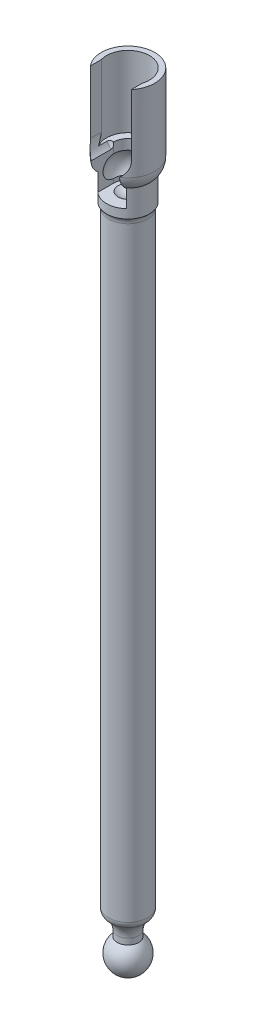
ISO-10303-21;
HEADER;
FILE_DESCRIPTION(('STEP AP214'),'2;1');
FILE_NAME('part.step','',(''),(''),'','','');
FILE_SCHEMA(('AUTOMOTIVE_DESIGN { 1 0 10303 214 1 1 1 1 }'));
ENDSEC;
DATA;
#1=APPLICATION_CONTEXT('core data for automotive mechanical design processes');
#2=APPLICATION_PROTOCOL_DEFINITION('international standard','automotive_design',2000,#1);
#3=PRODUCT_CONTEXT('',#1,'mechanical');
#4=PRODUCT('Part','Part','',(#3));
#5=PRODUCT_RELATED_PRODUCT_CATEGORY('part','',(#4));
#6=PRODUCT_DEFINITION_FORMATION('','',#4);
#7=PRODUCT_DEFINITION_CONTEXT('part definition',#1,'design');
#8=PRODUCT_DEFINITION('design','',#6,#7);
#9=PRODUCT_DEFINITION_SHAPE('','',#8);
#10=(LENGTH_UNIT() NAMED_UNIT(*) SI_UNIT(.MILLI.,.METRE.));
#11=(NAMED_UNIT(*) PLANE_ANGLE_UNIT() SI_UNIT($,.RADIAN.));
#12=(NAMED_UNIT(*) SI_UNIT($,.STERADIAN.) SOLID_ANGLE_UNIT());
#13=UNCERTAINTY_MEASURE_WITH_UNIT(LENGTH_MEASURE(1.E-05),#10,'distance_accuracy_value','');
#14=(GEOMETRIC_REPRESENTATION_CONTEXT(3) GLOBAL_UNCERTAINTY_ASSIGNED_CONTEXT((#13)) GLOBAL_UNIT_ASSIGNED_CONTEXT((#10,
#11,#12)) REPRESENTATION_CONTEXT('',''));
#15=CARTESIAN_POINT('',(0.,0.,0.));
#16=DIRECTION('',(0.,0.,1.));
#17=DIRECTION('',(1.,0.,0.));
#18=AXIS2_PLACEMENT_3D('',#15,#16,#17);
#19=CARTESIAN_POINT('',(0.,390.,0.));
#20=DIRECTION('',(0.,1.,0.));
#21=DIRECTION('',(0.,0.,1.));
#22=AXIS2_PLACEMENT_3D('',#19,#20,#21);
#23=PLANE('',#22);
#24=CARTESIAN_POINT('',(0.,390.,0.));
#25=DIRECTION('',(0.,1.,0.));
#26=DIRECTION('',(0.,0.,1.));
#27=AXIS2_PLACEMENT_3D('',#24,#25,#26);
#28=CIRCLE('',#27,12.);
#29=CARTESIAN_POINT('',(10.3048336165887,390.,6.14901651765742));
#30=VERTEX_POINT('',#29);
#31=CARTESIAN_POINT('',(-10.3048336165887,390.,6.14901651765739));
#32=VERTEX_POINT('',#31);
#33=EDGE_CURVE('E222',#30,#32,#28,.T.);
#34=ORIENTED_EDGE('',*,*,#33,.T.);
#35=DIRECTION('',(0.,0.,1.));
#36=VECTOR('',#35,1.);
#37=CARTESIAN_POINT('',(-10.3048336165887,390.,6.1490165176574));
#38=LINE('',#37,#36);
#39=CARTESIAN_POINT('',(-10.3048336165887,390.,1.5));
#40=VERTEX_POINT('',#39);
#41=EDGE_CURVE('E361',#32,#40,#38,.F.);
#42=ORIENTED_EDGE('',*,*,#41,.T.);
#43=CARTESIAN_POINT('',(-10.3048336165887,390.,1.5));
#44=CARTESIAN_POINT('',(-10.3048355156764,390.,1.46158188277618));
#45=CARTESIAN_POINT('',(-10.3031560827793,390.,1.42318343524848));
#46=CARTESIAN_POINT('',(-10.2964710002613,390.,1.34668709614987));
#47=CARTESIAN_POINT('',(-10.2914662196851,390.,1.3085891286832));
#48=CARTESIAN_POINT('',(-10.2715768600153,390.,1.1954469389797));
#49=CARTESIAN_POINT('',(-10.2518165014391,390.,1.12120517457586));
#50=CARTESIAN_POINT('',(-10.2001744096831,390.,0.977180085756621));
#51=CARTESIAN_POINT('',(-10.1682992005171,390.,0.907394385272954));
#52=CARTESIAN_POINT('',(-10.0937247632403,390.,0.773835282041916));
#53=CARTESIAN_POINT('',(-10.0510184680855,390.,0.710065842187068));
#54=CARTESIAN_POINT('',(-9.9543964620345,390.,0.587363486014589));
#55=CARTESIAN_POINT('',(-9.900090655276,390.,0.528739076773228));
#56=CARTESIAN_POINT('',(-9.78331311320155,390.,0.420348592512671));
#57=CARTESIAN_POINT('',(-9.72084084631768,390.,0.370583094632614));
#58=CARTESIAN_POINT('',(-9.58218638631705,390.,0.275361079867849));
#59=CARTESIAN_POINT('',(-9.50525218099368,390.,0.231001818262378));
#60=CARTESIAN_POINT('',(-9.34564760323151,390.,0.15397916263549));
#61=CARTESIAN_POINT('',(-9.26296827770835,390.,0.121334535555457));
#62=CARTESIAN_POINT('',(-9.07775316759587,390.,0.062575451710266));
#63=CARTESIAN_POINT('',(-8.97444491968277,390.,0.0389054671836883));
#64=CARTESIAN_POINT('',(-8.76573955696903,390.,0.00762805784349258));
#65=CARTESIAN_POINT('',(-8.66035018313294,390.,-3.05173401683437E-05));
#66=CARTESIAN_POINT('',(-8.55514670406013,390.,0.));
#67=B_SPLINE_CURVE_WITH_KNOTS('',3,(#43,#44,#45,#46,#47,#48,#49,#50,#51,#52,#53,#54,#55,#56,#57,
#58,#59,#60,#61,#62,#63,#64,#65,#66),.UNSPECIFIED.,.F.,.F.,(4,2,2,2,2,2,2,2,2,2,2,4),(0.,
0.115179201680137,0.230328314323595,0.459592903748564,0.688734205563041,0.918025403381416,
1.15678604986238,1.39556224540101,1.66093263366225,1.926726269344,2.24337458385086,
2.55900977182349),.UNSPECIFIED.);
#68=CARTESIAN_POINT('',(-8.55514670406013,390.,0.));
#69=VERTEX_POINT('',#68);
#70=EDGE_CURVE('E11',#40,#69,#67,.T.);
#71=ORIENTED_EDGE('',*,*,#70,.T.);
#72=DIRECTION('',(1.,0.,0.));
#73=VECTOR('',#72,1.);
#74=CARTESIAN_POINT('',(0.,390.,0.));
#75=LINE('',#74,#73);
#76=CARTESIAN_POINT('',(-8.,390.,0.));
#77=VERTEX_POINT('',#76);
#78=EDGE_CURVE('E191',#69,#77,#75,.T.);
#79=ORIENTED_EDGE('',*,*,#78,.T.);
#80=CARTESIAN_POINT('',(0.,390.,0.));
#81=DIRECTION('',(0.,-1.,0.));
#82=DIRECTION('',(0.,0.,1.));
#83=AXIS2_PLACEMENT_3D('',#80,#81,#82);
#84=CIRCLE('',#83,8.);
#85=CARTESIAN_POINT('',(8.,390.,0.));
#86=VERTEX_POINT('',#85);
#87=EDGE_CURVE('E218',#77,#86,#84,.T.);
#88=ORIENTED_EDGE('',*,*,#87,.T.);
#89=CARTESIAN_POINT('',(8.55514670406011,390.,0.));
#90=VERTEX_POINT('',#89);
#91=EDGE_CURVE('E430',#86,#90,#75,.T.);
#92=ORIENTED_EDGE('',*,*,#91,.T.);
#93=CARTESIAN_POINT('',(8.55514670406011,390.,0.));
#94=CARTESIAN_POINT('',(8.61894598459048,390.,1.14862435072787E-05));
#95=CARTESIAN_POINT('',(8.68270974756061,390.,0.00280767934706547));
#96=CARTESIAN_POINT('',(8.80980418022889,390.,0.0141538572855706));
#97=CARTESIAN_POINT('',(8.87313417339725,390.,0.0227113724203095));
#98=CARTESIAN_POINT('',(9.06197773156034,390.,0.0573476422173187));
#99=CARTESIAN_POINT('',(9.18603518002023,390.,0.0923918676810224));
#100=CARTESIAN_POINT('',(9.39442160378485,390.,0.175134874410832));
#101=CARTESIAN_POINT('',(9.48091807865962,390.,0.217464861611269));
#102=CARTESIAN_POINT('',(9.64565300021689,390.,0.315782721748237));
#103=CARTESIAN_POINT('',(9.72390788986952,390.,0.371742632439366));
#104=CARTESIAN_POINT('',(9.86977880660303,390.,0.497178056669186));
#105=CARTESIAN_POINT('',(9.937315560314,390.,0.566746485486068));
#106=CARTESIAN_POINT('',(10.0577848361831,390.,0.717689979042653));
#107=CARTESIAN_POINT('',(10.1107165006652,390.,0.799065736733387));
#108=CARTESIAN_POINT('',(10.1934055151879,390.,0.96036400709802));
#109=CARTESIAN_POINT('',(10.2252081910687,390.,1.03924198708278));
#110=CARTESIAN_POINT('',(10.2734438547387,390.,1.20146627780351));
#111=CARTESIAN_POINT('',(10.289917188737,390.,1.28480024500609));
#112=CARTESIAN_POINT('',(10.3004809437911,390.,1.39060488411318));
#113=CARTESIAN_POINT('',(10.3021135251816,390.,1.41246829883958));
#114=CARTESIAN_POINT('',(10.3042880848914,390.,1.45621779064411));
#115=CARTESIAN_POINT('',(10.3048316296093,390.,1.47810378980643));
#116=CARTESIAN_POINT('',(10.3048336165887,390.,1.5));
#117=B_SPLINE_CURVE_WITH_KNOTS('',3,(#93,#94,#95,#96,#97,#98,#99,#100,#101,#102,#103,#104,#105,
#106,#107,#108,#109,#110,#111,#112,#113,#114,#115,#116),.UNSPECIFIED.,.F.,.F.,(4,2,2,2,2,2,2,2,
2,2,2,4),(0.,0.191256633108737,0.382763733566355,0.766693488322859,1.05445145828848,
1.34162398331175,1.63083036420854,1.92005372498132,2.17382516490196,2.42692678369867,
2.49268291740254,2.55834440371891),.UNSPECIFIED.);
#118=CARTESIAN_POINT('',(10.3048336165887,390.,1.5));
#119=VERTEX_POINT('',#118);
#120=EDGE_CURVE('E322',#90,#119,#117,.T.);
#121=ORIENTED_EDGE('',*,*,#120,.T.);
#122=DIRECTION('',(0.,0.,-1.));
#123=VECTOR('',#122,1.);
#124=CARTESIAN_POINT('',(10.3048336165887,390.,0.));
#125=LINE('',#124,#123);
#126=EDGE_CURVE('E385',#119,#30,#125,.F.);
#127=ORIENTED_EDGE('',*,*,#126,.T.);
#128=EDGE_LOOP('',(#34,#42,#71,#79,#88,#92,#121,#127));
#129=FACE_BOUND('',#128,.T.);
#130=ADVANCED_FACE('F39',(#129),#23,.T.);
#131=CARTESIAN_POINT('',(-8.,390.,8.94427190999916));
#132=DIRECTION('',(-1.,0.,0.));
#133=DIRECTION('',(0.,0.,1.));
#134=AXIS2_PLACEMENT_3D('',#131,#132,#133);
#135=PLANE('',#134);
#136=DIRECTION('',(0.,0.,-1.));
#137=VECTOR('',#136,1.);
#138=CARTESIAN_POINT('',(-8.,387.141428428543,8.94427190999916));
#139=LINE('',#138,#137);
#140=CARTESIAN_POINT('',(-8.,387.141428428543,12.6885775404495));
#141=VERTEX_POINT('',#140);
#142=CARTESIAN_POINT('',(-8.,387.141428428543,1.5));
#143=VERTEX_POINT('',#142);
#144=EDGE_CURVE('E413',#141,#143,#139,.T.);
#145=ORIENTED_EDGE('',*,*,#144,.F.);
#146=CARTESIAN_POINT('',(-8.,387.141428428543,12.6885775404495));
#147=CARTESIAN_POINT('',(-8.,386.898462876069,12.6886131394239));
#148=CARTESIAN_POINT('',(-8.,386.655505778813,12.6781112860644));
#149=CARTESIAN_POINT('',(-8.,386.171424803875,12.6362919323324));
#150=CARTESIAN_POINT('',(-8.,385.930300657833,12.6049775408625));
#151=CARTESIAN_POINT('',(-8.,385.452582080144,12.521957983698));
#152=CARTESIAN_POINT('',(-8.,385.215973425988,12.470334578084));
#153=CARTESIAN_POINT('',(-8.,384.747997128312,12.3471893371486));
#154=CARTESIAN_POINT('',(-8.,384.516629464005,12.2756675807652));
#155=CARTESIAN_POINT('',(-8.,384.060686443359,12.1133635960303));
#156=CARTESIAN_POINT('',(-8.,383.83611293692,12.0225761750362));
#157=CARTESIAN_POINT('',(-8.,383.395322292463,11.8225798784256));
#158=CARTESIAN_POINT('',(-8.,383.179105421176,11.7133704153977));
#159=CARTESIAN_POINT('',(-8.,382.756178300218,11.4773839698307));
#160=CARTESIAN_POINT('',(-8.,382.549478825051,11.3505876986705));
#161=CARTESIAN_POINT('',(-8.,382.147081011294,11.0806431663899));
#162=CARTESIAN_POINT('',(-8.,381.951381594559,10.9374965119968));
#163=CARTESIAN_POINT('',(-8.,381.59470555737,10.654100298418));
#164=CARTESIAN_POINT('',(-8.,381.432374330467,10.5155490470673));
#165=CARTESIAN_POINT('',(-8.,381.117629533772,10.2276070666527));
#166=CARTESIAN_POINT('',(-8.,380.965215936044,10.078216368125));
#167=CARTESIAN_POINT('',(-8.,380.671080894728,9.76982716115273));
#168=CARTESIAN_POINT('',(-8.,380.529339277688,9.61084785844038));
#169=CARTESIAN_POINT('',(-8.,380.256566475064,9.28399738594609));
#170=CARTESIAN_POINT('',(-8.,380.125533299958,9.11612787747002));
#171=CARTESIAN_POINT('',(-8.,380.,8.94427190999914));
#172=B_SPLINE_CURVE_WITH_KNOTS('',3,(#146,#147,#148,#149,#150,#151,#152,#153,#154,#155,#156,
#157,#158,#159,#160,#161,#162,#163,#164,#165,#166,#167,#168,#169,#170,#171),.UNSPECIFIED.,.F.,
.F.,(4,2,2,2,2,2,2,2,2,2,2,2,4),(0.,0.728657115631353,1.45720541151812,2.18285024599277,
2.90849220183039,3.63432998771306,4.36019092228195,5.08685434624846,5.81344642344112,
6.4532028426167,7.09295745958117,7.73147068040973,8.36986500092226),.UNSPECIFIED.);
#173=CARTESIAN_POINT('',(-8.,380.,8.94427190999916));
#174=VERTEX_POINT('',#173);
#175=EDGE_CURVE('E278',#141,#174,#172,.T.);
#176=ORIENTED_EDGE('',*,*,#175,.T.);
#177=DIRECTION('',(0.,-1.,0.));
#178=VECTOR('',#177,1.);
#179=CARTESIAN_POINT('',(-8.,390.,8.94427190999916));
#180=LINE('',#179,#178);
#181=CARTESIAN_POINT('',(-8.,370.,8.94427190999916));
#182=VERTEX_POINT('',#181);
#183=EDGE_CURVE('E243',#174,#182,#180,.T.);
#184=ORIENTED_EDGE('',*,*,#183,.T.);
#185=DIRECTION('',(0.,0.,-1.));
#186=VECTOR('',#185,1.);
#187=CARTESIAN_POINT('',(-8.,370.,8.94427190999916));
#188=LINE('',#187,#186);
#189=CARTESIAN_POINT('',(-8.,370.,0.));
#190=VERTEX_POINT('',#189);
#191=EDGE_CURVE('E233',#182,#190,#188,.T.);
#192=ORIENTED_EDGE('',*,*,#191,.T.);
#193=DIRECTION('',(0.,-1.,0.));
#194=VECTOR('',#193,1.);
#195=CARTESIAN_POINT('',(-8.,390.,0.));
#196=LINE('',#195,#194);
#197=CARTESIAN_POINT('',(-8.,372.320233849739,0.));
#198=VERTEX_POINT('',#197);
#199=EDGE_CURVE('E226',#198,#190,#196,.T.);
#200=ORIENTED_EDGE('',*,*,#199,.F.);
#201=CARTESIAN_POINT('',(-8.,378.320233849739,0.));
#202=DIRECTION('',(-1.,0.,0.));
#203=DIRECTION('',(0.,0.,1.));
#204=AXIS2_PLACEMENT_3D('',#201,#202,#203);
#205=CIRCLE('',#204,6.00000000000002);
#206=CARTESIAN_POINT('',(-8.,384.320233849739,0.));
#207=VERTEX_POINT('',#206);
#208=EDGE_CURVE('E206',#207,#198,#205,.F.);
#209=ORIENTED_EDGE('',*,*,#208,.F.);
#210=CARTESIAN_POINT('',(-8.,389.263544930277,0.));
#211=VERTEX_POINT('',#210);
#212=EDGE_CURVE('E244',#211,#207,#196,.T.);
#213=ORIENTED_EDGE('',*,*,#212,.F.);
#214=CARTESIAN_POINT('',(-8.,389.263544930277,0.));
#215=CARTESIAN_POINT('',(-8.,389.175828882561,1.4202306377743E-05));
#216=CARTESIAN_POINT('',(-8.,389.088056385281,0.00319732635967229));
#217=CARTESIAN_POINT('',(-8.,388.912763730174,0.0165660170570594));
#218=CARTESIAN_POINT('',(-8.,388.825245363865,0.0267746818984981));
#219=CARTESIAN_POINT('',(-8.,388.650313757806,0.0550454277568731));
#220=CARTESIAN_POINT('',(-8.,388.562915884677,0.0732053251596353));
#221=CARTESIAN_POINT('',(-8.,388.390472362262,0.118123336334486));
#222=CARTESIAN_POINT('',(-8.,388.305423385499,0.144868529370792));
#223=CARTESIAN_POINT('',(-8.,388.126123480356,0.212547253538985));
#224=CARTESIAN_POINT('',(-8.,388.032440333649,0.255020038759695));
#225=CARTESIAN_POINT('',(-8.,387.852750091249,0.353410908149023));
#226=CARTESIAN_POINT('',(-8.,387.766713285102,0.409273524943437));
#227=CARTESIAN_POINT('',(-8.,387.620230611009,0.523788302037169));
#228=CARTESIAN_POINT('',(-8.,387.557971102053,0.580106820484953));
#229=CARTESIAN_POINT('',(-8.,387.443399912024,0.702203605586548));
#230=CARTESIAN_POINT('',(-8.,387.391083848602,0.767977682362797));
#231=CARTESIAN_POINT('',(-8.,387.307029456112,0.896337175669105));
#232=CARTESIAN_POINT('',(-8.,387.273314546302,0.957625888316977));
#233=CARTESIAN_POINT('',(-8.,387.216588162165,1.08493153835167));
#234=CARTESIAN_POINT('',(-8.,387.193558041748,1.15094000508947));
#235=CARTESIAN_POINT('',(-8.,387.164969779227,1.26438401751332));
#236=CARTESIAN_POINT('',(-8.,387.156181276776,1.31102412084218));
#237=CARTESIAN_POINT('',(-8.,387.144393873986,1.40509676669327));
#238=CARTESIAN_POINT('',(-8.,387.141403442762,1.45253036648368));
#239=CARTESIAN_POINT('',(-8.,387.141428428543,1.5));
#240=B_SPLINE_CURVE_WITH_KNOTS('',3,(#214,#215,#216,#217,#218,#219,#220,#221,#222,#223,#224,
#225,#226,#227,#228,#229,#230,#231,#232,#233,#234,#235,#236,#237,#238,#239),.UNSPECIFIED.,.F.,
.F.,(4,2,2,2,2,2,2,2,2,2,2,2,4),(0.,0.26317550836716,0.527220430824586,0.794609147164955,
1.06159731963414,1.36919184026961,1.67553352671452,1.92644575113212,2.17724713392359,
2.38623370421468,2.59485418612562,2.73689712471337,2.87914738647324),.UNSPECIFIED.);
#241=EDGE_CURVE('E55',#211,#143,#240,.T.);
#242=ORIENTED_EDGE('',*,*,#241,.T.);
#243=EDGE_LOOP('',(#145,#176,#184,#192,#200,#209,#213,#242));
#244=FACE_BOUND('',#243,.T.);
#245=ADVANCED_FACE('F298',(#244),#135,.F.);
#246=CARTESIAN_POINT('',(8.,390.,8.94427190999916));
#247=DIRECTION('',(1.,0.,0.));
#248=DIRECTION('',(0.,0.,-1.));
#249=AXIS2_PLACEMENT_3D('',#246,#247,#248);
#250=PLANE('',#249);
#251=DIRECTION('',(0.,0.,1.));
#252=VECTOR('',#251,1.);
#253=CARTESIAN_POINT('',(8.,387.141428428543,8.94427190999916));
#254=LINE('',#253,#252);
#255=CARTESIAN_POINT('',(8.,387.141428428543,1.5));
#256=VERTEX_POINT('',#255);
#257=CARTESIAN_POINT('',(8.,387.141428428543,12.6885775404495));
#258=VERTEX_POINT('',#257);
#259=EDGE_CURVE('E167',#256,#258,#254,.T.);
#260=ORIENTED_EDGE('',*,*,#259,.F.);
#261=CARTESIAN_POINT('',(8.,387.141428428543,1.5));
#262=CARTESIAN_POINT('',(8.,387.141424330208,1.46525533206328));
#263=CARTESIAN_POINT('',(8.,387.14301828448,1.43053023625968));
#264=CARTESIAN_POINT('',(8.,387.149347529171,1.36138527624327));
#265=CARTESIAN_POINT('',(8.,387.154081184923,1.32696526263627));
#266=CARTESIAN_POINT('',(8.,387.172820263181,1.225007222873));
#267=CARTESIAN_POINT('',(8.,387.191365644948,1.15825557666407));
#268=CARTESIAN_POINT('',(8.,387.239414556528,1.02903708788403));
#269=CARTESIAN_POINT('',(8.,387.268899624901,0.966563235460594));
#270=CARTESIAN_POINT('',(8.,387.337301458639,0.846936202027834));
#271=CARTESIAN_POINT('',(8.,387.376233774054,0.789792010491327));
#272=CARTESIAN_POINT('',(8.,387.475163972486,0.664857508014008));
#273=CARTESIAN_POINT('',(8.,387.537948718868,0.599275016111774));
#274=CARTESIAN_POINT('',(8.,387.673322504164,0.479256921050604));
#275=CARTESIAN_POINT('',(8.,387.745922845409,0.424834352714915));
#276=CARTESIAN_POINT('',(8.,387.924482981078,0.30987044685523));
#277=CARTESIAN_POINT('',(8.,388.033280747096,0.253751467827777));
#278=CARTESIAN_POINT('',(8.,388.25858801291,0.15945840390312));
#279=CARTESIAN_POINT('',(8.,388.37512407486,0.121350204219206));
#280=CARTESIAN_POINT('',(8.,388.619929014527,0.0592988759118445));
#281=CARTESIAN_POINT('',(8.,388.748468097181,0.0364378376238616));
#282=CARTESIAN_POINT('',(8.,388.941857628952,0.014224549978458));
#283=CARTESIAN_POINT('',(8.,389.006103755878,0.00883058567667091));
#284=CARTESIAN_POINT('',(8.,389.134745235892,0.0017228337795111));
#285=CARTESIAN_POINT('',(8.,389.199140408818,5.82453923082694E-06));
#286=CARTESIAN_POINT('',(8.,389.263544930277,0.));
#287=B_SPLINE_CURVE_WITH_KNOTS('',3,(#261,#262,#263,#264,#265,#266,#267,#268,#269,#270,#271,
#272,#273,#274,#275,#276,#277,#278,#279,#280,#281,#282,#283,#284,#285,#286),.UNSPECIFIED.,.F.,
.F.,(4,2,2,2,2,2,2,2,2,2,2,2,4),(0.,0.104159844629441,0.208265501582229,0.414952624569356,
0.621292524283753,0.827974388526941,1.09886551556622,1.37007126432829,1.73532201102305,
2.10189873283176,2.49230972046265,2.68564345933309,2.87880773517979),.UNSPECIFIED.);
#288=CARTESIAN_POINT('',(8.,389.263544930277,0.));
#289=VERTEX_POINT('',#288);
#290=EDGE_CURVE('E314',#256,#289,#287,.T.);
#291=ORIENTED_EDGE('',*,*,#290,.T.);
#292=DIRECTION('',(0.,-1.,0.));
#293=VECTOR('',#292,1.);
#294=CARTESIAN_POINT('',(8.,390.,0.));
#295=LINE('',#294,#293);
#296=CARTESIAN_POINT('',(8.,384.320233849739,0.));
#297=VERTEX_POINT('',#296);
#298=EDGE_CURVE('E62',#289,#297,#295,.T.);
#299=ORIENTED_EDGE('',*,*,#298,.T.);
#300=CARTESIAN_POINT('',(8.,378.320233849739,0.));
#301=DIRECTION('',(1.,0.,0.));
#302=DIRECTION('',(0.,0.,-1.));
#303=AXIS2_PLACEMENT_3D('',#300,#301,#302);
#304=CIRCLE('',#303,6.00000000000001);
#305=CARTESIAN_POINT('',(8.,372.320233849739,0.));
#306=VERTEX_POINT('',#305);
#307=EDGE_CURVE('E195',#306,#297,#304,.F.);
#308=ORIENTED_EDGE('',*,*,#307,.F.);
#309=CARTESIAN_POINT('',(8.,370.,0.));
#310=VERTEX_POINT('',#309);
#311=EDGE_CURVE('E250',#306,#310,#295,.T.);
#312=ORIENTED_EDGE('',*,*,#311,.T.);
#313=DIRECTION('',(0.,0.,1.));
#314=VECTOR('',#313,1.);
#315=CARTESIAN_POINT('',(8.,370.,8.94427190999916));
#316=LINE('',#315,#314);
#317=CARTESIAN_POINT('',(8.,370.,8.94427190999916));
#318=VERTEX_POINT('',#317);
#319=EDGE_CURVE('E223',#310,#318,#316,.T.);
#320=ORIENTED_EDGE('',*,*,#319,.T.);
#321=DIRECTION('',(0.,-1.,0.));
#322=VECTOR('',#321,1.);
#323=CARTESIAN_POINT('',(8.,390.,8.94427190999916));
#324=LINE('',#323,#322);
#325=CARTESIAN_POINT('',(8.,380.,8.94427190999916));
#326=VERTEX_POINT('',#325);
#327=EDGE_CURVE('E247',#326,#318,#324,.T.);
#328=ORIENTED_EDGE('',*,*,#327,.F.);
#329=CARTESIAN_POINT('',(8.,380.,8.94427190999916));
#330=CARTESIAN_POINT('',(8.,380.087993809562,9.06471502373126));
#331=CARTESIAN_POINT('',(8.,380.178659344654,9.18318543771296));
#332=CARTESIAN_POINT('',(8.,380.365286649349,9.41589752445157));
#333=CARTESIAN_POINT('',(8.,380.461248972676,9.53013875299763));
#334=CARTESIAN_POINT('',(8.,380.757082072617,9.86617019837588));
#335=CARTESIAN_POINT('',(8.,380.964809336784,10.0811450253048));
#336=CARTESIAN_POINT('',(8.,381.400247812207,10.4904976356245));
#337=CARTESIAN_POINT('',(8.,381.627990119435,10.6848422950904));
#338=CARTESIAN_POINT('',(8.,382.101480096575,11.0500599868774));
#339=CARTESIAN_POINT('',(8.,382.347220025434,11.2209430205403));
#340=CARTESIAN_POINT('',(8.,382.82567304668,11.5189996021718));
#341=CARTESIAN_POINT('',(8.,383.056669419221,11.6489361276573));
#342=CARTESIAN_POINT('',(8.,383.529539159405,11.8873378122989));
#343=CARTESIAN_POINT('',(8.,383.77141357282,11.9958009016476));
#344=CARTESIAN_POINT('',(8.,384.26336903747,12.1897596947942));
#345=CARTESIAN_POINT('',(8.,384.513423309229,12.2753232845862));
#346=CARTESIAN_POINT('',(8.,385.02026610618,12.4229457799655));
#347=CARTESIAN_POINT('',(8.,385.277051711362,12.4850147027149));
#348=CARTESIAN_POINT('',(8.,385.800456719516,12.5859890949804));
#349=CARTESIAN_POINT('',(8.,386.067170115651,12.6244083956641));
#350=CARTESIAN_POINT('',(8.,386.603061035023,12.675730680027));
#351=CARTESIAN_POINT('',(8.,386.872238764846,12.6886315044347));
#352=CARTESIAN_POINT('',(8.,387.141428428543,12.6885775404495));
#353=B_SPLINE_CURVE_WITH_KNOTS('',3,(#329,#330,#331,#332,#333,#334,#335,#336,#337,#338,#339,
#340,#341,#342,#343,#344,#345,#346,#347,#348,#349,#350,#351,#352),.UNSPECIFIED.,.F.,.F.,(4,2,2,
2,2,2,2,2,2,2,2,4),(0.,0.447413446247387,0.894873753824598,1.79024959175942,2.6870419723179,
3.58345086874787,4.37749958496141,5.17162480166954,5.96336906590607,6.75477538161792,
7.56195032354984,8.36919356248),.UNSPECIFIED.);
#354=EDGE_CURVE('E287',#326,#258,#353,.T.);
#355=ORIENTED_EDGE('',*,*,#354,.T.);
#356=EDGE_LOOP('',(#260,#291,#299,#308,#312,#320,#328,#355));
#357=FACE_BOUND('',#356,.T.);
#358=ADVANCED_FACE('F302',(#357),#250,.F.);
#359=CARTESIAN_POINT('',(0.,380.,0.));
#360=DIRECTION('',(0.,1.,0.));
#361=DIRECTION('',(0.,0.,1.));
#362=AXIS2_PLACEMENT_3D('',#359,#360,#361);
#363=CYLINDRICAL_SURFACE('',#362,12.);
#364=ORIENTED_EDGE('',*,*,#33,.F.);
#365=CARTESIAN_POINT('',(10.3048336165887,390.,6.14901651765743));
#366=CARTESIAN_POINT('',(10.3793600662662,390.138458480891,6.02414986924156));
#367=CARTESIAN_POINT('',(10.4507070059922,390.278748956289,5.89939657574922));
#368=CARTESIAN_POINT('',(10.5870925830736,390.563475754038,5.65097087904294));
#369=CARTESIAN_POINT('',(10.652127090981,390.707914711239,5.52729923090375));
#370=CARTESIAN_POINT('',(10.7780258150562,391.006419976795,5.27772603209669));
#371=CARTESIAN_POINT('',(10.8386616995415,391.160646141389,5.15189993237945));
#372=CARTESIAN_POINT('',(10.9530340638339,391.47456955367,4.90404337355847));
#373=CARTESIAN_POINT('',(11.0067723890852,391.634265323418,4.78201190584849));
#374=CARTESIAN_POINT('',(11.0983524828845,391.931609629531,4.56485735860328));
#375=CARTESIAN_POINT('',(11.1373284630927,392.068203291377,4.46877303083472));
#376=CARTESIAN_POINT('',(11.210251633929,392.34666776576,4.2825505197087));
#377=CARTESIAN_POINT('',(11.2442004919458,392.488536808945,4.19241037032146));
#378=CARTESIAN_POINT('',(11.306176467035,392.776042357532,4.02224127886219));
#379=CARTESIAN_POINT('',(11.33429709344,392.921568975611,3.94206259105065));
#380=CARTESIAN_POINT('',(11.384785214029,393.219643756334,3.79378249050668));
#381=CARTESIAN_POINT('',(11.4071575555844,393.372185874153,3.72567091705676));
#382=CARTESIAN_POINT('',(11.4378795129487,393.623739211132,3.62992890344069));
#383=CARTESIAN_POINT('',(11.4482951449855,393.720425563763,3.59687064202152));
#384=CARTESIAN_POINT('',(11.4664417626473,393.916324429282,3.53859237510287));
#385=CARTESIAN_POINT('',(11.4741751255132,394.015534621192,3.51336543095806));
#386=CARTESIAN_POINT('',(11.4868647627382,394.218252618803,3.47166491393906));
#387=CARTESIAN_POINT('',(11.4917570887499,394.321806965503,3.45539330743194));
#388=CARTESIAN_POINT('',(11.4983409553447,394.530463754358,3.43339405384914));
#389=CARTESIAN_POINT('',(11.5000217944918,394.635570200331,3.42770166093625));
#390=CARTESIAN_POINT('',(11.5,394.740770505328,3.42782730020139));
#391=B_SPLINE_CURVE_WITH_KNOTS('',3,(#365,#366,#367,#368,#369,#370,#371,#372,#373,#374,#375,
#376,#377,#378,#379,#380,#381,#382,#383,#384,#385,#386,#387,#388,#389,#390),.UNSPECIFIED.,.F.,
.F.,(4,2,2,2,2,2,2,2,2,2,2,2,4),(0.,0.602355634485653,1.20510269730712,1.82913234004656,
2.45299467389984,2.96726844710209,3.48137126278856,3.98644732283018,4.49109605773612,
4.79892977456671,5.10648996324629,5.42072855179667,5.73601244399753),.UNSPECIFIED.);
#392=CARTESIAN_POINT('',(11.5,394.740770505328,3.42782730020054));
#393=VERTEX_POINT('',#392);
#394=EDGE_CURVE('E378',#30,#393,#391,.T.);
#395=ORIENTED_EDGE('',*,*,#394,.T.);
#396=DIRECTION('',(0.,1.,0.));
#397=VECTOR('',#396,1.);
#398=CARTESIAN_POINT('',(11.5,380.,3.42782730020054));
#399=LINE('',#398,#397);
#400=CARTESIAN_POINT('',(11.5,430.,3.42782730020053));
#401=VERTEX_POINT('',#400);
#402=EDGE_CURVE('E426',#393,#401,#399,.T.);
#403=ORIENTED_EDGE('',*,*,#402,.T.);
#404=CARTESIAN_POINT('',(0.,430.,0.));
#405=DIRECTION('',(0.,-1.,0.));
#406=DIRECTION('',(0.,0.,1.));
#407=AXIS2_PLACEMENT_3D('',#404,#405,#406);
#408=CIRCLE('',#407,12.);
#409=CARTESIAN_POINT('',(-11.5,430.,3.42782730020053));
#410=VERTEX_POINT('',#409);
#411=EDGE_CURVE('E184',#410,#401,#408,.T.);
#412=ORIENTED_EDGE('',*,*,#411,.F.);
#413=DIRECTION('',(0.,1.,0.));
#414=VECTOR('',#413,1.);
#415=CARTESIAN_POINT('',(-11.5,380.,3.42782730020052));
#416=LINE('',#415,#414);
#417=CARTESIAN_POINT('',(-11.5,394.740770505328,3.42782730020052));
#418=VERTEX_POINT('',#417);
#419=EDGE_CURVE('E166',#410,#418,#416,.F.);
#420=ORIENTED_EDGE('',*,*,#419,.T.);
#421=CARTESIAN_POINT('',(-11.5,394.740770505328,3.42782730020052));
#422=CARTESIAN_POINT('',(-11.5000152474252,394.645554637438,3.42773961747477));
#423=CARTESIAN_POINT('',(-11.4986407744606,394.550397054255,3.43238756291764));
#424=CARTESIAN_POINT('',(-11.4932372658806,394.361220381345,3.45045660644129));
#425=CARTESIAN_POINT('',(-11.4892147411818,394.267199073747,3.46385618574433));
#426=CARTESIAN_POINT('',(-11.4787422860537,394.082664266431,3.49839567829025));
#427=CARTESIAN_POINT('',(-11.4723413477818,393.992118124179,3.51937914998929));
#428=CARTESIAN_POINT('',(-11.4572770000594,393.813024211763,3.56811705961151));
#429=CARTESIAN_POINT('',(-11.4486120949784,393.724477804842,3.59587597275182));
#430=CARTESIAN_POINT('',(-11.42348601697,393.498214572368,3.67512615175911));
#431=CARTESIAN_POINT('',(-11.4054365585224,393.362201789987,3.73097426167221));
#432=CARTESIAN_POINT('',(-11.3646957384185,393.095786839649,3.8532907114372));
#433=CARTESIAN_POINT('',(-11.3420010799347,392.965388736586,3.91976658673287));
#434=CARTESIAN_POINT('',(-11.291995155194,392.707452124256,4.06160021747871));
#435=CARTESIAN_POINT('',(-11.2646107046265,392.580002323201,4.13709192159829));
#436=CARTESIAN_POINT('',(-11.2058152132522,392.329611896104,4.29380121720077));
#437=CARTESIAN_POINT('',(-11.1744026697785,392.206672974956,4.37502094038813));
#438=CARTESIAN_POINT('',(-11.0880786637613,391.893200194608,4.59072965071683));
#439=CARTESIAN_POINT('',(-11.0302460301885,391.705628787075,4.72834830304254));
#440=CARTESIAN_POINT('',(-10.905338846337,391.338239869929,5.0097272883567));
#441=CARTESIAN_POINT('',(-10.838258710231,391.158427133686,5.15349129687597));
#442=CARTESIAN_POINT('',(-10.697954529705,390.812530942286,5.43856068030748));
#443=CARTESIAN_POINT('',(-10.6250913645917,390.646186540405,5.57972821316704));
#444=CARTESIAN_POINT('',(-10.4711396480371,390.319109773709,5.86356836826047));
#445=CARTESIAN_POINT('',(-10.390062439555,390.158370070924,6.00623867760965));
#446=CARTESIAN_POINT('',(-10.3048336165887,390.,6.14901651765739));
#447=B_SPLINE_CURVE_WITH_KNOTS('',3,(#421,#422,#423,#424,#425,#426,#427,#428,#429,#430,#431,
#432,#433,#434,#435,#436,#437,#438,#439,#440,#441,#442,#443,#444,#445,#446),.UNSPECIFIED.,.F.,
.F.,(4,2,2,2,2,2,2,2,2,2,2,2,4),(0.,0.285431217594008,0.570163237267822,0.84932886094122,
1.12867937643773,1.5722974505907,2.01623147137988,2.46785821497855,2.91965392927923,
3.63829124302212,4.35736455745266,5.04718989163346,5.73607528911033),.UNSPECIFIED.);
#448=EDGE_CURVE('E344',#418,#32,#447,.T.);
#449=ORIENTED_EDGE('',*,*,#448,.T.);
#450=EDGE_LOOP('',(#364,#395,#403,#412,#420,#449));
#451=FACE_BOUND('',#450,.T.);
#452=ADVANCED_FACE('F366',(#451),#363,.F.);
#453=CARTESIAN_POINT('',(0.,380.,0.));
#454=DIRECTION('',(0.,1.,0.));
#455=DIRECTION('',(0.,0.,1.));
#456=AXIS2_PLACEMENT_3D('',#453,#454,#455);
#457=CYLINDRICAL_SURFACE('',#456,15.);
#458=CARTESIAN_POINT('',(0.,430.,0.));
#459=DIRECTION('',(0.,1.,0.));
#460=DIRECTION('',(0.,0.,1.));
#461=AXIS2_PLACEMENT_3D('',#458,#459,#460);
#462=CIRCLE('',#461,15.);
#463=CARTESIAN_POINT('',(11.5,430.,9.63068014212912));
#464=VERTEX_POINT('',#463);
#465=CARTESIAN_POINT('',(-11.5,430.,9.63068014212911));
#466=VERTEX_POINT('',#465);
#467=EDGE_CURVE('E159',#464,#466,#462,.T.);
#468=ORIENTED_EDGE('',*,*,#467,.F.);
#469=DIRECTION('',(0.,1.,0.));
#470=VECTOR('',#469,1.);
#471=CARTESIAN_POINT('',(11.5,380.,9.63068014212912));
#472=LINE('',#471,#470);
#473=CARTESIAN_POINT('',(11.5,394.740770505328,9.63068014212912));
#474=VERTEX_POINT('',#473);
#475=EDGE_CURVE('E406',#464,#474,#472,.F.);
#476=ORIENTED_EDGE('',*,*,#475,.T.);
#477=CARTESIAN_POINT('',(11.5,394.740770505328,9.63068014212912));
#478=CARTESIAN_POINT('',(11.5000028225629,394.625050994723,9.63067181063723));
#479=CARTESIAN_POINT('',(11.4979906331165,394.509354970087,9.63308005101244));
#480=CARTESIAN_POINT('',(11.4899694083897,394.278317622247,9.6426480325515));
#481=CARTESIAN_POINT('',(11.4839610549031,394.162976241907,9.64980696318976));
#482=CARTESIAN_POINT('',(11.4600292062356,393.818444029964,9.67824258374631));
#483=CARTESIAN_POINT('',(11.4361985716258,393.590181303466,9.70647890428714));
#484=CARTESIAN_POINT('',(11.3739564792046,393.142220196569,9.77933204530074));
#485=CARTESIAN_POINT('',(11.3357836037197,392.922443289172,9.82368046339795));
#486=CARTESIAN_POINT('',(11.2457091125454,392.489067866619,9.92666603220462));
#487=CARTESIAN_POINT('',(11.1938007479989,392.275472446095,9.98531020593648));
#488=CARTESIAN_POINT('',(11.0777358892748,391.857435168566,10.1139100992634));
#489=CARTESIAN_POINT('',(11.0136942406394,391.652928066714,10.1837588821824));
#490=CARTESIAN_POINT('',(10.8739380294952,391.251581149001,10.3328576429893));
#491=CARTESIAN_POINT('',(10.7982247758718,391.054740476502,10.4121065664903));
#492=CARTESIAN_POINT('',(10.5533911679484,390.47297149436,10.6620971961609));
#493=CARTESIAN_POINT('',(10.3674291063592,390.099800956745,10.8441003501288));
#494=CARTESIAN_POINT('',(10.017413673555,389.493229953767,11.1664672250811));
#495=CARTESIAN_POINT('',(9.86361675617261,389.251570791343,11.3028727704055));
#496=CARTESIAN_POINT('',(9.53706407043071,388.783675255003,11.5797316143463));
#497=CARTESIAN_POINT('',(9.36430213584111,388.557443936241,11.7201862184512));
#498=CARTESIAN_POINT('',(9.00284536220229,388.123675513009,12.0000140672448));
#499=CARTESIAN_POINT('',(8.81439264946125,387.91593000432,12.1393768930877));
#500=CARTESIAN_POINT('',(8.51869819044319,387.616337510743,12.3469141439496));
#501=CARTESIAN_POINT('',(8.41798541233627,387.518495862355,12.4158285385987));
#502=CARTESIAN_POINT('',(8.21223167549029,387.326885059742,12.5528694573546));
#503=CARTESIAN_POINT('',(8.10719050523239,387.233116105001,12.6209959427491));
#504=CARTESIAN_POINT('',(8.00000000000001,387.141428428543,12.6885775404495));
#505=B_SPLINE_CURVE_WITH_KNOTS('',3,(#477,#478,#479,#480,#481,#482,#483,#484,#485,#486,#487,
#488,#489,#490,#491,#492,#493,#494,#495,#496,#497,#498,#499,#500,#501,#502,#503,#504),
.UNSPECIFIED.,.F.,.F.,(4,2,2,2,2,2,2,2,2,2,2,2,2,4),(0.,0.347070656558025,0.694082113855049,
1.38642233614181,2.06772173460251,2.74935650937967,3.42483548748266,4.10023877055962,
5.46078191892813,6.41176197940013,7.36305215969879,8.30170599317084,8.77084677688047,
9.2400105137019),.UNSPECIFIED.);
#506=EDGE_CURVE('E370',#474,#258,#505,.T.);
#507=ORIENTED_EDGE('',*,*,#506,.T.);
#508=CARTESIAN_POINT('',(0.,387.141428428543,0.));
#509=DIRECTION('',(0.,-1.,0.));
#510=DIRECTION('',(0.,0.,-1.));
#511=AXIS2_PLACEMENT_3D('',#508,#509,#510);
#512=CIRCLE('',#511,15.);
#513=EDGE_CURVE('E272',#258,#141,#512,.F.);
#514=ORIENTED_EDGE('',*,*,#513,.T.);
#515=CARTESIAN_POINT('',(-8.,387.141428428543,12.6885775404495));
#516=CARTESIAN_POINT('',(-8.11338340434429,387.238414429384,12.6170913513913));
#517=CARTESIAN_POINT('',(-8.2243608230218,387.337726574346,12.5449963238109));
#518=CARTESIAN_POINT('',(-8.4414692028086,387.540900696108,12.3999452385987));
#519=CARTESIAN_POINT('',(-8.54760043875796,387.644762414233,12.3269892300914));
#520=CARTESIAN_POINT('',(-8.85881206043739,387.963157961498,12.1072676062421));
#521=CARTESIAN_POINT('',(-9.05657908441943,388.184389730414,11.9597319318118));
#522=CARTESIAN_POINT('',(-9.43525674322132,388.647920091657,11.6633928583225));
#523=CARTESIAN_POINT('',(-9.61582134428245,388.890514213675,11.5146109157531));
#524=CARTESIAN_POINT('',(-9.95547223378903,389.393159626136,11.2222417189896));
#525=CARTESIAN_POINT('',(-10.1145674557653,389.65320358774,11.0786523224676));
#526=CARTESIAN_POINT('',(-10.3698961180704,390.117491105617,10.8391434428242));
#527=CARTESIAN_POINT('',(-10.4714444196409,390.317626204865,10.7408978058143));
#528=CARTESIAN_POINT('',(-10.6619706510437,390.727134739736,10.5517950126643));
#529=CARTESIAN_POINT('',(-10.7509520800147,390.936505582354,10.4609358028385));
#530=CARTESIAN_POINT('',(-10.9148122634909,391.362470027833,10.2898390353311));
#531=CARTESIAN_POINT('',(-10.9898103309329,391.578982021411,10.2095135325539));
#532=CARTESIAN_POINT('',(-11.1256810096932,392.020553308738,10.0612793175224));
#533=CARTESIAN_POINT('',(-11.1865567771438,392.245610679609,9.99336783163363));
#534=CARTESIAN_POINT('',(-11.2818200494111,392.65501766028,9.88557392146544));
#535=CARTESIAN_POINT('',(-11.3190863168199,392.837937560173,9.84280084397241));
#536=CARTESIAN_POINT('',(-11.3835659852198,393.207691305539,9.76815472838076));
#537=CARTESIAN_POINT('',(-11.4107832238112,393.394523628042,9.73627752962618));
#538=CARTESIAN_POINT('',(-11.4549741488961,393.773645672538,9.6842565004962));
#539=CARTESIAN_POINT('',(-11.4718045295783,393.965975021391,9.66427694619409));
#540=CARTESIAN_POINT('',(-11.4943452949066,394.352440098757,9.63743182804507));
#541=CARTESIAN_POINT('',(-11.5000410335256,394.546577869393,9.63058353672061));
#542=CARTESIAN_POINT('',(-11.5,394.740770505328,9.63068014212912));
#543=B_SPLINE_CURVE_WITH_KNOTS('',3,(#515,#516,#517,#518,#519,#520,#521,#522,#523,#524,#525,
#526,#527,#528,#529,#530,#531,#532,#533,#534,#535,#536,#537,#538,#539,#540,#541,#542),
.UNSPECIFIED.,.F.,.F.,(4,2,2,2,2,2,2,2,2,2,2,2,2,4),(0.,0.496260812634527,0.992493445937661,
1.98553298476569,2.99555183685128,4.00514910983533,4.73958204122158,5.47381007112151,
6.20145375035658,6.92893465463227,7.50292689784559,8.07669971320894,8.65822146755627,
9.24050761719453),.UNSPECIFIED.);
#544=CARTESIAN_POINT('',(-11.5,394.740770505328,9.63068014212911));
#545=VERTEX_POINT('',#544);
#546=EDGE_CURVE('E161',#141,#545,#543,.T.);
#547=ORIENTED_EDGE('',*,*,#546,.T.);
#548=DIRECTION('',(0.,1.,0.));
#549=VECTOR('',#548,1.);
#550=CARTESIAN_POINT('',(-11.5,380.,9.63068014212911));
#551=LINE('',#550,#549);
#552=EDGE_CURVE('E154',#545,#466,#551,.T.);
#553=ORIENTED_EDGE('',*,*,#552,.T.);
#554=EDGE_LOOP('',(#468,#476,#507,#514,#547,#553));
#555=FACE_BOUND('',#554,.T.);
#556=ADVANCED_FACE('F156',(#555),#457,.T.);
#557=CARTESIAN_POINT('',(0.,430.,0.));
#558=DIRECTION('',(0.,1.,0.));
#559=DIRECTION('',(0.,0.,1.));
#560=AXIS2_PLACEMENT_3D('',#557,#558,#559);
#561=PLANE('',#560);
#562=ORIENTED_EDGE('',*,*,#411,.T.);
#563=DIRECTION('',(0.,0.,-1.));
#564=VECTOR('',#563,1.);
#565=CARTESIAN_POINT('',(11.5,430.,40.));
#566=LINE('',#565,#564);
#567=EDGE_CURVE('E177',#464,#401,#566,.T.);
#568=ORIENTED_EDGE('',*,*,#567,.F.);
#569=ORIENTED_EDGE('',*,*,#467,.T.);
#570=DIRECTION('',(0.,0.,-1.));
#571=VECTOR('',#570,1.);
#572=CARTESIAN_POINT('',(-11.5,430.,40.));
#573=LINE('',#572,#571);
#574=EDGE_CURVE('E170',#466,#410,#573,.T.);
#575=ORIENTED_EDGE('',*,*,#574,.T.);
#576=EDGE_LOOP('',(#562,#568,#569,#575));
#577=FACE_BOUND('',#576,.T.);
#578=ADVANCED_FACE('F180',(#577),#561,.T.);
#579=CARTESIAN_POINT('',(0.,390.,0.));
#580=DIRECTION('',(0.,-1.,0.));
#581=DIRECTION('',(0.,0.,-1.));
#582=AXIS2_PLACEMENT_3D('',#579,#580,#581);
#583=CYLINDRICAL_SURFACE('',#582,12.);
#584=CARTESIAN_POINT('',(0.,365.,0.));
#585=DIRECTION('',(0.,1.,0.));
#586=DIRECTION('',(0.,0.,1.));
#587=AXIS2_PLACEMENT_3D('',#584,#585,#586);
#588=CIRCLE('',#587,12.);
#589=CARTESIAN_POINT('',(0.,365.,12.));
#590=VERTEX_POINT('',#589);
#591=EDGE_CURVE('E210',#590,#590,#588,.T.);
#592=ORIENTED_EDGE('',*,*,#591,.T.);
#593=EDGE_LOOP('',(#592));
#594=FACE_BOUND('',#593,.T.);
#595=CARTESIAN_POINT('',(0.,380.,0.));
#596=DIRECTION('',(0.,-1.,0.));
#597=DIRECTION('',(0.,0.,1.));
#598=AXIS2_PLACEMENT_3D('',#595,#596,#597);
#599=CIRCLE('',#598,12.);
#600=EDGE_CURVE('E183',#174,#326,#599,.T.);
#601=ORIENTED_EDGE('',*,*,#600,.T.);
#602=ORIENTED_EDGE('',*,*,#327,.T.);
#603=CARTESIAN_POINT('',(0.,370.,0.));
#604=DIRECTION('',(0.,1.,0.));
#605=DIRECTION('',(0.,0.,1.));
#606=AXIS2_PLACEMENT_3D('',#603,#604,#605);
#607=CIRCLE('',#606,12.);
#608=EDGE_CURVE('E209',#182,#318,#607,.T.);
#609=ORIENTED_EDGE('',*,*,#608,.F.);
#610=ORIENTED_EDGE('',*,*,#183,.F.);
#611=EDGE_LOOP('',(#601,#602,#609,#610));
#612=FACE_BOUND('',#611,.T.);
#613=ADVANCED_FACE('F306',(#594,#612),#583,.T.);
#614=CARTESIAN_POINT('',(0.,390.,0.));
#615=DIRECTION('',(0.,-1.,0.));
#616=DIRECTION('',(0.,0.,-1.));
#617=AXIS2_PLACEMENT_3D('',#614,#615,#616);
#618=CYLINDRICAL_SURFACE('',#617,8.);
#619=CARTESIAN_POINT('',(0.,372.320233849739,0.));
#620=DIRECTION('',(0.,0.999999999999998,0.));
#621=DIRECTION('',(0.,0.,1.));
#622=AXIS2_PLACEMENT_3D('',#619,#620,#621);
#623=CIRCLE('',#622,8.);
#624=EDGE_CURVE('E203',#198,#306,#623,.F.);
#625=ORIENTED_EDGE('',*,*,#624,.F.);
#626=ORIENTED_EDGE('',*,*,#199,.T.);
#627=CARTESIAN_POINT('',(0.,370.,0.));
#628=DIRECTION('',(0.,-1.,0.));
#629=DIRECTION('',(0.,0.,1.));
#630=AXIS2_PLACEMENT_3D('',#627,#628,#629);
#631=CIRCLE('',#630,8.);
#632=EDGE_CURVE('E214',#190,#310,#631,.T.);
#633=ORIENTED_EDGE('',*,*,#632,.T.);
#634=ORIENTED_EDGE('',*,*,#311,.F.);
#635=EDGE_LOOP('',(#625,#626,#633,#634));
#636=FACE_BOUND('',#635,.T.);
#637=ADVANCED_FACE('F504',(#636),#618,.F.);
#638=CARTESIAN_POINT('',(0.,384.320233849739,0.));
#639=DIRECTION('',(0.,-0.999999999999998,0.));
#640=DIRECTION('',(0.,0.,-1.));
#641=AXIS2_PLACEMENT_3D('',#638,#639,#640);
#642=CIRCLE('',#641,8.);
#643=EDGE_CURVE('E199',#297,#207,#642,.F.);
#644=ORIENTED_EDGE('',*,*,#643,.F.);
#645=ORIENTED_EDGE('',*,*,#298,.F.);
#646=EDGE_CURVE('E251',#86,#289,#295,.T.);
#647=ORIENTED_EDGE('',*,*,#646,.F.);
#648=ORIENTED_EDGE('',*,*,#87,.F.);
#649=EDGE_CURVE('E239',#77,#211,#196,.T.);
#650=ORIENTED_EDGE('',*,*,#649,.T.);
#651=ORIENTED_EDGE('',*,*,#212,.T.);
#652=EDGE_LOOP('',(#644,#645,#647,#648,#650,#651));
#653=FACE_BOUND('',#652,.T.);
#654=ADVANCED_FACE('F445',(#653),#618,.F.);
#655=CARTESIAN_POINT('',(0.,370.,0.));
#656=DIRECTION('',(0.,-1.,0.));
#657=DIRECTION('',(0.,0.,-1.));
#658=AXIS2_PLACEMENT_3D('',#655,#656,#657);
#659=CYLINDRICAL_SURFACE('',#658,11.);
#660=CARTESIAN_POINT('',(0.,362.,0.));
#661=DIRECTION('',(0.,1.,0.));
#662=DIRECTION('',(0.,0.,1.));
#663=AXIS2_PLACEMENT_3D('',#660,#661,#662);
#664=CIRCLE('',#663,11.);
#665=CARTESIAN_POINT('',(0.,362.,11.));
#666=VERTEX_POINT('',#665);
#667=EDGE_CURVE('E237',#666,#666,#664,.F.);
#668=ORIENTED_EDGE('',*,*,#667,.T.);
#669=EDGE_LOOP('',(#668));
#670=FACE_BOUND('',#669,.T.);
#671=CARTESIAN_POINT('',(0.,22.5200858496546,0.));
#672=DIRECTION('',(0.,-1.,0.));
#673=DIRECTION('',(0.,0.,-1.));
#674=AXIS2_PLACEMENT_3D('',#671,#672,#673);
#675=CIRCLE('',#674,11.);
#676=CARTESIAN_POINT('',(0.,22.5200858496546,-11.));
#677=VERTEX_POINT('',#676);
#678=EDGE_CURVE('E262',#677,#677,#675,.F.);
#679=ORIENTED_EDGE('',*,*,#678,.T.);
#680=EDGE_LOOP('',(#679));
#681=FACE_BOUND('',#680,.T.);
#682=ADVANCED_FACE('F519',(#670,#681),#659,.T.);
#683=CARTESIAN_POINT('',(0.,0.,0.));
#684=DIRECTION('',(-1.,0.,0.));
#685=DIRECTION('',(0.,1.,0.));
#686=AXIS2_PLACEMENT_3D('',#683,#684,#685);
#687=SPHERICAL_SURFACE('',#686,10.);
#688=CARTESIAN_POINT('',(0.,0.,0.));
#689=DIRECTION('',(0.,-1.,0.));
#690=DIRECTION('',(0.,0.,-1.));
#691=AXIS2_PLACEMENT_3D('',#688,#689,#690);
#692=SPHERICAL_SURFACE('',#691,10.);
#693=CARTESIAN_POINT('',(0.,8.,0.));
#694=DIRECTION('',(0.,-1.,0.));
#695=DIRECTION('',(0.,0.,-1.));
#696=AXIS2_PLACEMENT_3D('',#693,#694,#695);
#697=CIRCLE('',#696,6.);
#698=CARTESIAN_POINT('',(0.,8.,-6.));
#699=VERTEX_POINT('',#698);
#700=EDGE_CURVE('E254',#699,#699,#697,.F.);
#701=ORIENTED_EDGE('',*,*,#700,.F.);
#702=EDGE_LOOP('',(#701));
#703=FACE_BOUND('',#702,.T.);
#704=ADVANCED_FACE('F526',(#703),#692,.T.);
#705=CARTESIAN_POINT('',(0.,20.,0.));
#706=DIRECTION('',(0.,-1.,0.));
#707=DIRECTION('',(0.,0.,-1.));
#708=AXIS2_PLACEMENT_3D('',#705,#706,#707);
#709=CYLINDRICAL_SURFACE('',#708,6.);
#710=CARTESIAN_POINT('',(0.,11.3397459621556,0.));
#711=DIRECTION('',(0.,1.,0.));
#712=DIRECTION('',(0.,0.,1.));
#713=AXIS2_PLACEMENT_3D('',#710,#711,#712);
#714=CIRCLE('',#713,6.);
#715=CARTESIAN_POINT('',(0.,11.3397459621556,6.));
#716=VERTEX_POINT('',#715);
#717=EDGE_CURVE('E258',#716,#716,#714,.F.);
#718=ORIENTED_EDGE('',*,*,#717,.T.);
#719=EDGE_LOOP('',(#718));
#720=FACE_BOUND('',#719,.T.);
#721=ORIENTED_EDGE('',*,*,#700,.T.);
#722=EDGE_LOOP('',(#721));
#723=FACE_BOUND('',#722,.T.);
#724=ADVANCED_FACE('F535',(#720,#723),#709,.T.);
#725=CARTESIAN_POINT('',(0.,11.3397459621556,0.));
#726=DIRECTION('',(0.,1.,0.));
#727=DIRECTION('',(0.,0.,1.));
#728=AXIS2_PLACEMENT_3D('',#725,#726,#727);
#729=TOROIDAL_SURFACE('',#728,16.,10.);
#730=CARTESIAN_POINT('',(0.,18.7933058871549,0.));
#731=DIRECTION('',(0.,-1.,0.));
#732=DIRECTION('',(0.,0.,-1.));
#733=AXIS2_PLACEMENT_3D('',#730,#731,#732);
#734=CIRCLE('',#733,9.33333333333334);
#735=CARTESIAN_POINT('',(0.,18.7933058871549,-9.33333333333334));
#736=VERTEX_POINT('',#735);
#737=EDGE_CURVE('E238',#736,#736,#734,.T.);
#738=ORIENTED_EDGE('',*,*,#737,.T.);
#739=EDGE_LOOP('',(#738));
#740=FACE_BOUND('',#739,.T.);
#741=ORIENTED_EDGE('',*,*,#717,.F.);
#742=EDGE_LOOP('',(#741));
#743=FACE_BOUND('',#742,.T.);
#744=ADVANCED_FACE('F543',(#740,#743),#729,.F.);
#745=CARTESIAN_POINT('',(0.,22.5200858496546,0.));
#746=DIRECTION('',(0.,-1.,0.));
#747=DIRECTION('',(0.,0.,-1.));
#748=AXIS2_PLACEMENT_3D('',#745,#746,#747);
#749=TOROIDAL_SURFACE('',#748,6.,5.);
#750=ORIENTED_EDGE('',*,*,#737,.F.);
#751=EDGE_LOOP('',(#750));
#752=FACE_BOUND('',#751,.T.);
#753=ORIENTED_EDGE('',*,*,#678,.F.);
#754=EDGE_LOOP('',(#753));
#755=FACE_BOUND('',#754,.T.);
#756=ADVANCED_FACE('F551',(#752,#755),#749,.T.);
#757=CARTESIAN_POINT('',(0.,370.,0.));
#758=DIRECTION('',(0.,1.,0.));
#759=DIRECTION('',(0.,0.,1.));
#760=AXIS2_PLACEMENT_3D('',#757,#758,#759);
#761=PLANE('',#760);
#762=CARTESIAN_POINT('',(0.,370.,0.));
#763=DIRECTION('',(0.,1.,0.));
#764=DIRECTION('',(0.,0.,1.));
#765=AXIS2_PLACEMENT_3D('',#762,#763,#764);
#766=CIRCLE('',#765,5.5474055815);
#767=CARTESIAN_POINT('',(0.,370.,5.5474055815));
#768=VERTEX_POINT('',#767);
#769=EDGE_CURVE('E189',#768,#768,#766,.F.);
#770=ORIENTED_EDGE('',*,*,#769,.T.);
#771=EDGE_LOOP('',(#770));
#772=FACE_BOUND('',#771,.T.);
#773=ORIENTED_EDGE('',*,*,#191,.F.);
#774=ORIENTED_EDGE('',*,*,#608,.T.);
#775=ORIENTED_EDGE('',*,*,#319,.F.);
#776=ORIENTED_EDGE('',*,*,#632,.F.);
#777=EDGE_LOOP('',(#773,#774,#775,#776));
#778=FACE_BOUND('',#777,.T.);
#779=ADVANCED_FACE('F558',(#772,#778),#761,.T.);
#780=CARTESIAN_POINT('',(0.,362.,0.));
#781=DIRECTION('',(0.,1.,0.));
#782=DIRECTION('',(0.,0.,1.));
#783=AXIS2_PLACEMENT_3D('',#780,#781,#782);
#784=TOROIDAL_SURFACE('',#783,16.,5.);
#785=ORIENTED_EDGE('',*,*,#667,.F.);
#786=EDGE_LOOP('',(#785));
#787=FACE_BOUND('',#786,.T.);
#788=ORIENTED_EDGE('',*,*,#591,.F.);
#789=EDGE_LOOP('',(#788));
#790=FACE_BOUND('',#789,.T.);
#791=ADVANCED_FACE('F565',(#787,#790),#784,.F.);
#792=CARTESIAN_POINT('',(0.,378.320233849739,0.));
#793=DIRECTION('',(0.,-1.,0.));
#794=DIRECTION('',(-1.,0.,0.));
#795=AXIS2_PLACEMENT_3D('',#792,#793,#794);
#796=SPHERICAL_SURFACE('',#795,10.);
#797=ORIENTED_EDGE('',*,*,#769,.F.);
#798=EDGE_LOOP('',(#797));
#799=FACE_BOUND('',#798,.T.);
#800=ADVANCED_FACE('F573',(#799),#796,.F.);
#801=ORIENTED_EDGE('',*,*,#208,.T.);
#802=ORIENTED_EDGE('',*,*,#624,.T.);
#803=ORIENTED_EDGE('',*,*,#307,.T.);
#804=ORIENTED_EDGE('',*,*,#643,.T.);
#805=EDGE_LOOP('',(#801,#802,#803,#804));
#806=FACE_BOUND('',#805,.T.);
#807=ADVANCED_FACE('F579',(#806),#796,.F.);
#808=CARTESIAN_POINT('',(0.,387.141428428543,0.));
#809=DIRECTION('',(0.,-1.,0.));
#810=DIRECTION('',(0.,0.,-1.));
#811=AXIS2_PLACEMENT_3D('',#808,#809,#810);
#812=DEGENERATE_TOROIDAL_SURFACE('',#811,5.,10.,.T.);
#813=ORIENTED_EDGE('',*,*,#354,.F.);
#814=ORIENTED_EDGE('',*,*,#600,.F.);
#815=ORIENTED_EDGE('',*,*,#175,.F.);
#816=ORIENTED_EDGE('',*,*,#513,.F.);
#817=EDGE_LOOP('',(#813,#814,#815,#816));
#818=FACE_BOUND('',#817,.T.);
#819=ADVANCED_FACE('F294',(#818),#812,.T.);
#820=CARTESIAN_POINT('',(-11.5,430.,40.));
#821=DIRECTION('',(1.,0.,0.));
#822=DIRECTION('',(0.,0.,-1.));
#823=AXIS2_PLACEMENT_3D('',#820,#821,#822);
#824=PLANE('',#823);
#825=ORIENTED_EDGE('',*,*,#552,.F.);
#826=DIRECTION('',(0.,0.,-1.));
#827=VECTOR('',#826,1.);
#828=CARTESIAN_POINT('',(-11.5,394.740770505328,0.));
#829=LINE('',#828,#827);
#830=EDGE_CURVE('E388',#545,#418,#829,.T.);
#831=ORIENTED_EDGE('',*,*,#830,.T.);
#832=ORIENTED_EDGE('',*,*,#419,.F.);
#833=ORIENTED_EDGE('',*,*,#574,.F.);
#834=EDGE_LOOP('',(#825,#831,#832,#833));
#835=FACE_BOUND('',#834,.T.);
#836=ADVANCED_FACE('F171',(#835),#824,.T.);
#837=CARTESIAN_POINT('',(0.,0.,0.));
#838=DIRECTION('',(0.,0.,1.));
#839=DIRECTION('',(1.,0.,0.));
#840=AXIS2_PLACEMENT_3D('',#837,#838,#839);
#841=PLANE('',#840);
#842=ORIENTED_EDGE('',*,*,#78,.F.);
#843=CARTESIAN_POINT('',(-1.5,394.740770505328,0.));
#844=DIRECTION('',(0.,0.,1.));
#845=DIRECTION('',(1.,0.,0.));
#846=AXIS2_PLACEMENT_3D('',#843,#844,#845);
#847=CIRCLE('',#846,8.5);
#848=EDGE_CURVE('E444',#69,#211,#847,.T.);
#849=ORIENTED_EDGE('',*,*,#848,.T.);
#850=ORIENTED_EDGE('',*,*,#649,.F.);
#851=EDGE_LOOP('',(#842,#849,#850));
#852=FACE_BOUND('',#851,.T.);
#853=ADVANCED_FACE('F443',(#852),#841,.T.);
#854=CARTESIAN_POINT('',(11.5,430.,40.));
#855=DIRECTION('',(-1.,0.,0.));
#856=DIRECTION('',(0.,0.,1.));
#857=AXIS2_PLACEMENT_3D('',#854,#855,#856);
#858=PLANE('',#857);
#859=ORIENTED_EDGE('',*,*,#402,.F.);
#860=DIRECTION('',(0.,0.,1.));
#861=VECTOR('',#860,1.);
#862=CARTESIAN_POINT('',(11.5,394.740770505328,9.63068014212912));
#863=LINE('',#862,#861);
#864=EDGE_CURVE('E390',#393,#474,#863,.T.);
#865=ORIENTED_EDGE('',*,*,#864,.T.);
#866=ORIENTED_EDGE('',*,*,#475,.F.);
#867=ORIENTED_EDGE('',*,*,#567,.T.);
#868=EDGE_LOOP('',(#859,#865,#866,#867));
#869=FACE_BOUND('',#868,.T.);
#870=ADVANCED_FACE('F458',(#869),#858,.T.);
#871=ORIENTED_EDGE('',*,*,#646,.T.);
#872=CARTESIAN_POINT('',(1.49999999999998,394.740770505328,0.));
#873=DIRECTION('',(0.,0.,1.));
#874=DIRECTION('',(1.,0.,0.));
#875=AXIS2_PLACEMENT_3D('',#872,#873,#874);
#876=CIRCLE('',#875,8.5);
#877=EDGE_CURVE('E360',#289,#90,#876,.T.);
#878=ORIENTED_EDGE('',*,*,#877,.T.);
#879=ORIENTED_EDGE('',*,*,#91,.F.);
#880=EDGE_LOOP('',(#871,#878,#879));
#881=FACE_BOUND('',#880,.T.);
#882=ADVANCED_FACE('F448',(#881),#841,.T.);
#883=CARTESIAN_POINT('',(1.5,394.740770505328,40.));
#884=DIRECTION('',(0.,0.,-1.));
#885=DIRECTION('',(-1.,0.,0.));
#886=AXIS2_PLACEMENT_3D('',#883,#884,#885);
#887=CYLINDRICAL_SURFACE('',#886,10.);
#888=ORIENTED_EDGE('',*,*,#126,.F.);
#889=CARTESIAN_POINT('',(1.49999999999998,394.740770505328,1.5));
#890=DIRECTION('',(0.,0.,1.));
#891=DIRECTION('',(1.,0.,0.));
#892=AXIS2_PLACEMENT_3D('',#889,#890,#891);
#893=CIRCLE('',#892,10.);
#894=EDGE_CURVE('E411',#119,#256,#893,.F.);
#895=ORIENTED_EDGE('',*,*,#894,.T.);
#896=ORIENTED_EDGE('',*,*,#259,.T.);
#897=ORIENTED_EDGE('',*,*,#506,.F.);
#898=ORIENTED_EDGE('',*,*,#864,.F.);
#899=ORIENTED_EDGE('',*,*,#394,.F.);
#900=EDGE_LOOP('',(#888,#895,#896,#897,#898,#899));
#901=FACE_BOUND('',#900,.T.);
#902=ADVANCED_FACE('F339',(#901),#887,.F.);
#903=CARTESIAN_POINT('',(-1.5,394.740770505328,40.));
#904=DIRECTION('',(0.,0.,1.));
#905=DIRECTION('',(1.,0.,0.));
#906=AXIS2_PLACEMENT_3D('',#903,#904,#905);
#907=CYLINDRICAL_SURFACE('',#906,10.);
#908=ORIENTED_EDGE('',*,*,#144,.T.);
#909=CARTESIAN_POINT('',(-1.5,394.740770505328,1.5));
#910=DIRECTION('',(0.,0.,1.));
#911=DIRECTION('',(1.,0.,0.));
#912=AXIS2_PLACEMENT_3D('',#909,#910,#911);
#913=CIRCLE('',#912,10.);
#914=EDGE_CURVE('E454',#143,#40,#913,.F.);
#915=ORIENTED_EDGE('',*,*,#914,.T.);
#916=ORIENTED_EDGE('',*,*,#41,.F.);
#917=ORIENTED_EDGE('',*,*,#448,.F.);
#918=ORIENTED_EDGE('',*,*,#830,.F.);
#919=ORIENTED_EDGE('',*,*,#546,.F.);
#920=EDGE_LOOP('',(#908,#915,#916,#917,#918,#919));
#921=FACE_BOUND('',#920,.T.);
#922=ADVANCED_FACE('F334',(#921),#907,.F.);
#923=CARTESIAN_POINT('',(1.49999999999998,394.740770505328,1.5));
#924=DIRECTION('',(0.,0.,1.));
#925=DIRECTION('',(1.,0.,0.));
#926=AXIS2_PLACEMENT_3D('',#923,#924,#925);
#927=TOROIDAL_SURFACE('',#926,8.5,1.5);
#928=ORIENTED_EDGE('',*,*,#290,.F.);
#929=ORIENTED_EDGE('',*,*,#894,.F.);
#930=ORIENTED_EDGE('',*,*,#120,.F.);
#931=ORIENTED_EDGE('',*,*,#877,.F.);
#932=EDGE_LOOP('',(#928,#929,#930,#931));
#933=FACE_BOUND('',#932,.T.);
#934=ADVANCED_FACE('F330',(#933),#927,.F.);
#935=CARTESIAN_POINT('',(-1.5,394.740770505328,1.5));
#936=DIRECTION('',(0.,0.,1.));
#937=DIRECTION('',(1.,0.,0.));
#938=AXIS2_PLACEMENT_3D('',#935,#936,#937);
#939=TOROIDAL_SURFACE('',#938,8.5,1.5);
#940=ORIENTED_EDGE('',*,*,#70,.F.);
#941=ORIENTED_EDGE('',*,*,#914,.F.);
#942=ORIENTED_EDGE('',*,*,#241,.F.);
#943=ORIENTED_EDGE('',*,*,#848,.F.);
#944=EDGE_LOOP('',(#940,#941,#942,#943));
#945=FACE_BOUND('',#944,.T.);
#946=ADVANCED_FACE('F41',(#945),#939,.F.);
#947=CLOSED_SHELL('',(#130,#245,#358,#452,#556,#578,#613,#637,#654,#682,#704,#724,#744,#756,
#779,#791,#800,#807,#819,#836,#853,#870,#882,#902,#922,#934,#946));
#948=MANIFOLD_SOLID_BREP('B2',#947);
#949=ADVANCED_BREP_SHAPE_REPRESENTATION('',(#18,#948),#14);
#950=SHAPE_DEFINITION_REPRESENTATION(#9,#949);
ENDSEC;
END-ISO-10303-21;
